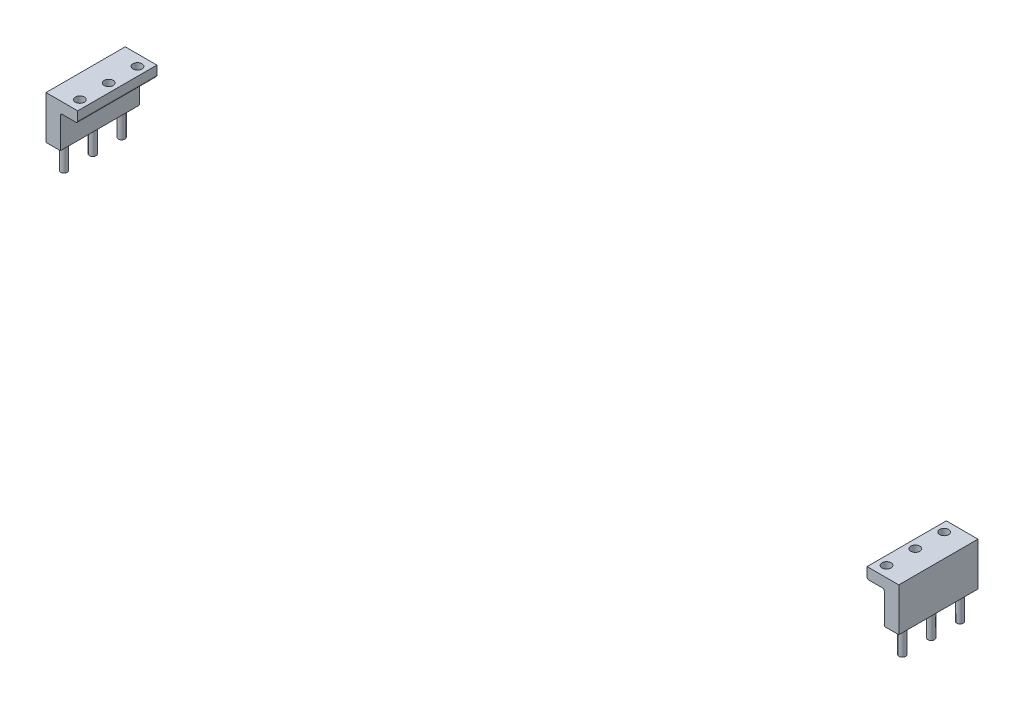
ISO-10303-21;
HEADER;
FILE_DESCRIPTION(('STEP AP214'),'2;1');
FILE_NAME('part.step','',(''),(''),'','','');
FILE_SCHEMA(('AUTOMOTIVE_DESIGN { 1 0 10303 214 1 1 1 1 }'));
ENDSEC;
DATA;
#1=APPLICATION_CONTEXT('core data for automotive mechanical design processes');
#2=APPLICATION_PROTOCOL_DEFINITION('international standard','automotive_design',2000,#1);
#3=PRODUCT_CONTEXT('',#1,'mechanical');
#4=PRODUCT('Part','Part','',(#3));
#5=PRODUCT_RELATED_PRODUCT_CATEGORY('part','',(#4));
#6=PRODUCT_DEFINITION_FORMATION('','',#4);
#7=PRODUCT_DEFINITION_CONTEXT('part definition',#1,'design');
#8=PRODUCT_DEFINITION('design','',#6,#7);
#9=PRODUCT_DEFINITION_SHAPE('','',#8);
#10=(LENGTH_UNIT() NAMED_UNIT(*) SI_UNIT(.MILLI.,.METRE.));
#11=(NAMED_UNIT(*) PLANE_ANGLE_UNIT() SI_UNIT($,.RADIAN.));
#12=(NAMED_UNIT(*) SI_UNIT($,.STERADIAN.) SOLID_ANGLE_UNIT());
#13=UNCERTAINTY_MEASURE_WITH_UNIT(LENGTH_MEASURE(1.E-05),#10,'distance_accuracy_value','');
#14=(GEOMETRIC_REPRESENTATION_CONTEXT(3) GLOBAL_UNCERTAINTY_ASSIGNED_CONTEXT((#13)) GLOBAL_UNIT_ASSIGNED_CONTEXT((#10,
#11,#12)) REPRESENTATION_CONTEXT('',''));
#15=CARTESIAN_POINT('',(0.,0.,0.));
#16=DIRECTION('',(0.,0.,1.));
#17=DIRECTION('',(1.,0.,0.));
#18=AXIS2_PLACEMENT_3D('',#15,#16,#17);
#19=CARTESIAN_POINT('',(374.55475,-81.3562,76.2));
#20=DIRECTION('',(0.,1.,0.));
#21=DIRECTION('',(0.,0.,1.));
#22=AXIS2_PLACEMENT_3D('',#19,#20,#21);
#23=PLANE('',#22);
#24=CARTESIAN_POINT('',(375.285,-81.3562,76.2));
#25=DIRECTION('',(0.,1.,0.));
#26=DIRECTION('',(0.,0.,-1.));
#27=AXIS2_PLACEMENT_3D('',#24,#25,#26);
#28=CIRCLE('',#27,1.4605);
#29=CARTESIAN_POINT('',(375.285,-81.3562,74.7395));
#30=VERTEX_POINT('',#29);
#31=EDGE_CURVE('P0_E11',#30,#30,#28,.T.);
#32=ORIENTED_EDGE('',*,*,#31,.F.);
#33=EDGE_LOOP('',(#32));
#34=FACE_BOUND('',#33,.T.);
#35=ADVANCED_FACE('P0_F17',(#34),#23,.F.);
#36=CARTESIAN_POINT('',(375.285,-75.6031,76.2));
#37=DIRECTION('',(0.,-1.,0.));
#38=DIRECTION('',(0.,0.,-1.));
#39=AXIS2_PLACEMENT_3D('',#36,#37,#38);
#40=CYLINDRICAL_SURFACE('',#39,1.4605);
#41=ORIENTED_EDGE('',*,*,#31,.T.);
#42=EDGE_LOOP('',(#41));
#43=FACE_BOUND('',#42,.T.);
#44=CARTESIAN_POINT('',(375.285,-71.12,76.2));
#45=DIRECTION('',(0.,1.,0.));
#46=DIRECTION('',(0.,0.,-1.));
#47=AXIS2_PLACEMENT_3D('',#44,#45,#46);
#48=CIRCLE('',#47,1.4605);
#49=CARTESIAN_POINT('',(375.285,-71.12,74.7395));
#50=VERTEX_POINT('',#49);
#51=EDGE_CURVE('P0_E164',#50,#50,#48,.T.);
#52=ORIENTED_EDGE('',*,*,#51,.F.);
#53=EDGE_LOOP('',(#52));
#54=FACE_BOUND('',#53,.T.);
#55=ADVANCED_FACE('P0_F175',(#43,#54),#40,.T.);
#56=CARTESIAN_POINT('',(375.285,-69.85,76.2));
#57=DIRECTION('',(0.,1.,0.));
#58=DIRECTION('',(0.,0.,1.));
#59=AXIS2_PLACEMENT_3D('',#56,#57,#58);
#60=CONICAL_SURFACE('',#59,2.7686,0.800175412804942);
#61=ORIENTED_EDGE('',*,*,#51,.T.);
#62=EDGE_LOOP('',(#61));
#63=FACE_BOUND('',#62,.T.);
#64=CARTESIAN_POINT('',(375.285,-69.85,76.2));
#65=DIRECTION('',(0.,1.,0.));
#66=DIRECTION('',(0.,0.,-1.));
#67=AXIS2_PLACEMENT_3D('',#64,#65,#66);
#68=CIRCLE('',#67,2.7686);
#69=CARTESIAN_POINT('',(375.285,-69.85,73.4314));
#70=VERTEX_POINT('',#69);
#71=EDGE_CURVE('P0_E24',#70,#70,#68,.T.);
#72=ORIENTED_EDGE('',*,*,#71,.F.);
#73=EDGE_LOOP('',(#72));
#74=FACE_BOUND('',#73,.T.);
#75=ADVANCED_FACE('P0_F172',(#63,#74),#60,.T.);
#76=CARTESIAN_POINT('',(374.55475,-81.3562,88.9));
#77=DIRECTION('',(0.,1.,0.));
#78=DIRECTION('',(0.,0.,1.));
#79=AXIS2_PLACEMENT_3D('',#76,#77,#78);
#80=PLANE('',#79);
#81=CARTESIAN_POINT('',(375.285,-81.3562,88.9));
#82=DIRECTION('',(0.,1.,0.));
#83=DIRECTION('',(0.,0.,-1.));
#84=AXIS2_PLACEMENT_3D('',#81,#82,#83);
#85=CIRCLE('',#84,1.4605);
#86=CARTESIAN_POINT('',(375.285,-81.3562,87.4395));
#87=VERTEX_POINT('',#86);
#88=EDGE_CURVE('P0_E161',#87,#87,#85,.T.);
#89=ORIENTED_EDGE('',*,*,#88,.F.);
#90=EDGE_LOOP('',(#89));
#91=FACE_BOUND('',#90,.T.);
#92=ADVANCED_FACE('P0_F174',(#91),#80,.F.);
#93=CARTESIAN_POINT('',(375.285,-75.6031,88.9));
#94=DIRECTION('',(0.,-1.,0.));
#95=DIRECTION('',(0.,0.,-1.));
#96=AXIS2_PLACEMENT_3D('',#93,#94,#95);
#97=CYLINDRICAL_SURFACE('',#96,1.4605);
#98=ORIENTED_EDGE('',*,*,#88,.T.);
#99=EDGE_LOOP('',(#98));
#100=FACE_BOUND('',#99,.T.);
#101=CARTESIAN_POINT('',(375.285,-71.12,88.9));
#102=DIRECTION('',(0.,1.,0.));
#103=DIRECTION('',(0.,0.,-1.));
#104=AXIS2_PLACEMENT_3D('',#101,#102,#103);
#105=CIRCLE('',#104,1.4605);
#106=CARTESIAN_POINT('',(375.285,-71.12,87.4395));
#107=VERTEX_POINT('',#106);
#108=EDGE_CURVE('P0_E155',#107,#107,#105,.T.);
#109=ORIENTED_EDGE('',*,*,#108,.F.);
#110=EDGE_LOOP('',(#109));
#111=FACE_BOUND('',#110,.T.);
#112=ADVANCED_FACE('P0_F183',(#100,#111),#97,.T.);
#113=CARTESIAN_POINT('',(375.285,-69.85,88.9));
#114=DIRECTION('',(0.,1.,0.));
#115=DIRECTION('',(0.,0.,1.));
#116=AXIS2_PLACEMENT_3D('',#113,#114,#115);
#117=CONICAL_SURFACE('',#116,2.7686,0.800175412804942);
#118=ORIENTED_EDGE('',*,*,#108,.T.);
#119=EDGE_LOOP('',(#118));
#120=FACE_BOUND('',#119,.T.);
#121=CARTESIAN_POINT('',(375.285,-69.85,88.9));
#122=DIRECTION('',(0.,1.,0.));
#123=DIRECTION('',(0.,0.,-1.));
#124=AXIS2_PLACEMENT_3D('',#121,#122,#123);
#125=CIRCLE('',#124,2.7686);
#126=CARTESIAN_POINT('',(375.285,-69.85,86.1314));
#127=VERTEX_POINT('',#126);
#128=EDGE_CURVE('P0_E158',#127,#127,#125,.T.);
#129=ORIENTED_EDGE('',*,*,#128,.F.);
#130=EDGE_LOOP('',(#129));
#131=FACE_BOUND('',#130,.T.);
#132=ADVANCED_FACE('P0_F216',(#120,#131),#117,.T.);
#133=CARTESIAN_POINT('',(364.49,-53.18125,106.3625));
#134=DIRECTION('',(1.,0.,0.));
#135=DIRECTION('',(0.,0.,1.));
#136=AXIS2_PLACEMENT_3D('',#133,#134,#135);
#137=PLANE('',#136);
#138=DIRECTION('',(0.,1.,0.));
#139=VECTOR('',#138,1.);
#140=CARTESIAN_POINT('',(364.49,-53.18125,106.3625));
#141=LINE('',#140,#139);
#142=CARTESIAN_POINT('',(364.49,-54.7243,106.3625));
#143=VERTEX_POINT('',#142);
#144=CARTESIAN_POINT('',(364.49,-50.8,106.3625));
#145=VERTEX_POINT('',#144);
#146=EDGE_CURVE('P0_E82',#143,#145,#141,.T.);
#147=ORIENTED_EDGE('',*,*,#146,.T.);
#148=DIRECTION('',(0.,0.,-1.));
#149=VECTOR('',#148,1.);
#150=CARTESIAN_POINT('',(364.49,-50.8,106.3625));
#151=LINE('',#150,#149);
#152=CARTESIAN_POINT('',(364.49,-50.8,71.4375));
#153=VERTEX_POINT('',#152);
#154=EDGE_CURVE('P0_E90',#145,#153,#151,.T.);
#155=ORIENTED_EDGE('',*,*,#154,.T.);
#156=DIRECTION('',(0.,1.,0.));
#157=VECTOR('',#156,1.);
#158=CARTESIAN_POINT('',(364.49,-53.18125,71.4375));
#159=LINE('',#158,#157);
#160=CARTESIAN_POINT('',(364.49,-54.7243,71.4375));
#161=VERTEX_POINT('',#160);
#162=EDGE_CURVE('P0_E123',#161,#153,#159,.T.);
#163=ORIENTED_EDGE('',*,*,#162,.F.);
#164=DIRECTION('',(0.,0.,-1.));
#165=VECTOR('',#164,1.);
#166=CARTESIAN_POINT('',(364.49,-54.7243,106.3625));
#167=LINE('',#166,#165);
#168=EDGE_CURVE('P0_E97',#143,#161,#167,.T.);
#169=ORIENTED_EDGE('',*,*,#168,.F.);
#170=EDGE_LOOP('',(#147,#155,#163,#169));
#171=FACE_BOUND('',#170,.T.);
#172=ADVANCED_FACE('P0_F101',(#171),#137,.F.);
#173=CARTESIAN_POINT('',(371.475,-50.8,106.3625));
#174=DIRECTION('',(0.,-1.,0.));
#175=DIRECTION('',(0.,0.,-1.));
#176=AXIS2_PLACEMENT_3D('',#173,#174,#175);
#177=PLANE('',#176);
#178=CARTESIAN_POINT('',(368.3,-50.8,101.6));
#179=DIRECTION('',(0.,1.,0.));
#180=DIRECTION('',(0.,0.,-1.));
#181=AXIS2_PLACEMENT_3D('',#178,#179,#180);
#182=CIRCLE('',#181,1.9939);
#183=CARTESIAN_POINT('',(368.3,-50.8,99.6061));
#184=VERTEX_POINT('',#183);
#185=EDGE_CURVE('P0_E109',#184,#184,#182,.T.);
#186=ORIENTED_EDGE('',*,*,#185,.F.);
#187=EDGE_LOOP('',(#186));
#188=FACE_BOUND('',#187,.T.);
#189=CARTESIAN_POINT('',(368.3,-50.8,88.9));
#190=DIRECTION('',(0.,1.,0.));
#191=DIRECTION('',(0.,0.,-1.));
#192=AXIS2_PLACEMENT_3D('',#189,#190,#191);
#193=CIRCLE('',#192,1.9939);
#194=CARTESIAN_POINT('',(368.3,-50.8,86.9061));
#195=VERTEX_POINT('',#194);
#196=EDGE_CURVE('P0_E371',#195,#195,#193,.T.);
#197=ORIENTED_EDGE('',*,*,#196,.F.);
#198=EDGE_LOOP('',(#197));
#199=FACE_BOUND('',#198,.T.);
#200=CARTESIAN_POINT('',(368.3,-50.8,76.2));
#201=DIRECTION('',(0.,1.,0.));
#202=DIRECTION('',(0.,0.,-1.));
#203=AXIS2_PLACEMENT_3D('',#200,#201,#202);
#204=CIRCLE('',#203,1.9939);
#205=CARTESIAN_POINT('',(368.3,-50.8,74.2061));
#206=VERTEX_POINT('',#205);
#207=EDGE_CURVE('P0_E364',#206,#206,#204,.T.);
#208=ORIENTED_EDGE('',*,*,#207,.F.);
#209=EDGE_LOOP('',(#208));
#210=FACE_BOUND('',#209,.T.);
#211=DIRECTION('',(1.,0.,0.));
#212=VECTOR('',#211,1.);
#213=CARTESIAN_POINT('',(371.475,-50.8,71.4375));
#214=LINE('',#213,#212);
#215=CARTESIAN_POINT('',(378.46,-50.8,71.4375));
#216=VERTEX_POINT('',#215);
#217=EDGE_CURVE('P0_E93',#153,#216,#214,.T.);
#218=ORIENTED_EDGE('',*,*,#217,.F.);
#219=ORIENTED_EDGE('',*,*,#154,.F.);
#220=DIRECTION('',(1.,0.,0.));
#221=VECTOR('',#220,1.);
#222=CARTESIAN_POINT('',(371.475,-50.8,106.3625));
#223=LINE('',#222,#221);
#224=CARTESIAN_POINT('',(378.46,-50.8,106.3625));
#225=VERTEX_POINT('',#224);
#226=EDGE_CURVE('P0_E78',#145,#225,#223,.T.);
#227=ORIENTED_EDGE('',*,*,#226,.T.);
#228=DIRECTION('',(0.,0.,-1.));
#229=VECTOR('',#228,1.);
#230=CARTESIAN_POINT('',(378.46,-50.8,106.3625));
#231=LINE('',#230,#229);
#232=EDGE_CURVE('P0_E98',#225,#216,#231,.T.);
#233=ORIENTED_EDGE('',*,*,#232,.T.);
#234=EDGE_LOOP('',(#218,#219,#227,#233));
#235=FACE_BOUND('',#234,.T.);
#236=ADVANCED_FACE('P0_F91',(#188,#199,#210,#235),#177,.F.);
#237=CARTESIAN_POINT('',(378.46,-60.325,106.3625));
#238=DIRECTION('',(-1.,0.,0.));
#239=DIRECTION('',(0.,0.,-1.));
#240=AXIS2_PLACEMENT_3D('',#237,#238,#239);
#241=PLANE('',#240);
#242=DIRECTION('',(0.,-1.,0.));
#243=VECTOR('',#242,1.);
#244=CARTESIAN_POINT('',(378.46,-60.325,71.4375));
#245=LINE('',#244,#243);
#246=CARTESIAN_POINT('',(378.46,-69.85,71.4375));
#247=VERTEX_POINT('',#246);
#248=EDGE_CURVE('P0_E126',#216,#247,#245,.T.);
#249=ORIENTED_EDGE('',*,*,#248,.F.);
#250=ORIENTED_EDGE('',*,*,#232,.F.);
#251=DIRECTION('',(0.,-1.,0.));
#252=VECTOR('',#251,1.);
#253=CARTESIAN_POINT('',(378.46,-60.325,106.3625));
#254=LINE('',#253,#252);
#255=CARTESIAN_POINT('',(378.46,-69.85,106.3625));
#256=VERTEX_POINT('',#255);
#257=EDGE_CURVE('P0_E84',#225,#256,#254,.T.);
#258=ORIENTED_EDGE('',*,*,#257,.T.);
#259=DIRECTION('',(0.,0.,-1.));
#260=VECTOR('',#259,1.);
#261=CARTESIAN_POINT('',(378.46,-69.85,106.3625));
#262=LINE('',#261,#260);
#263=EDGE_CURVE('P0_E136',#256,#247,#262,.T.);
#264=ORIENTED_EDGE('',*,*,#263,.T.);
#265=EDGE_LOOP('',(#249,#250,#258,#264));
#266=FACE_BOUND('',#265,.T.);
#267=ADVANCED_FACE('P0_F237',(#266),#241,.F.);
#268=CARTESIAN_POINT('',(375.285,-69.85,106.3625));
#269=DIRECTION('',(0.,1.,0.));
#270=DIRECTION('',(0.,0.,1.));
#271=AXIS2_PLACEMENT_3D('',#268,#269,#270);
#272=PLANE('',#271);
#273=ORIENTED_EDGE('',*,*,#71,.T.);
#274=EDGE_LOOP('',(#273));
#275=FACE_BOUND('',#274,.T.);
#276=ORIENTED_EDGE('',*,*,#128,.T.);
#277=EDGE_LOOP('',(#276));
#278=FACE_BOUND('',#277,.T.);
#279=CARTESIAN_POINT('',(375.285,-69.85,101.6));
#280=DIRECTION('',(0.,1.,0.));
#281=DIRECTION('',(0.,0.,-1.));
#282=AXIS2_PLACEMENT_3D('',#279,#280,#281);
#283=CIRCLE('',#282,2.7686);
#284=CARTESIAN_POINT('',(375.285,-69.85,98.8314));
#285=VERTEX_POINT('',#284);
#286=EDGE_CURVE('P0_E154',#285,#285,#283,.T.);
#287=ORIENTED_EDGE('',*,*,#286,.T.);
#288=EDGE_LOOP('',(#287));
#289=FACE_BOUND('',#288,.T.);
#290=DIRECTION('',(-1.,0.,0.));
#291=VECTOR('',#290,1.);
#292=CARTESIAN_POINT('',(375.285,-69.85,71.4375));
#293=LINE('',#292,#291);
#294=CARTESIAN_POINT('',(372.11,-69.85,71.4375));
#295=VERTEX_POINT('',#294);
#296=EDGE_CURVE('P0_E129',#247,#295,#293,.T.);
#297=ORIENTED_EDGE('',*,*,#296,.F.);
#298=ORIENTED_EDGE('',*,*,#263,.F.);
#299=DIRECTION('',(-1.,0.,0.));
#300=VECTOR('',#299,1.);
#301=CARTESIAN_POINT('',(375.285,-69.85,106.3625));
#302=LINE('',#301,#300);
#303=CARTESIAN_POINT('',(372.11,-69.85,106.3625));
#304=VERTEX_POINT('',#303);
#305=EDGE_CURVE('P0_E113',#256,#304,#302,.T.);
#306=ORIENTED_EDGE('',*,*,#305,.T.);
#307=DIRECTION('',(0.,0.,-1.));
#308=VECTOR('',#307,1.);
#309=CARTESIAN_POINT('',(372.11,-69.85,106.3625));
#310=LINE('',#309,#308);
#311=EDGE_CURVE('P0_E122',#304,#295,#310,.T.);
#312=ORIENTED_EDGE('',*,*,#311,.T.);
#313=EDGE_LOOP('',(#297,#298,#306,#312));
#314=FACE_BOUND('',#313,.T.);
#315=ADVANCED_FACE('P0_F169',(#275,#278,#289,#314),#272,.F.);
#316=CARTESIAN_POINT('',(372.11,-62.70625,106.3625));
#317=DIRECTION('',(1.,0.,0.));
#318=DIRECTION('',(0.,0.,1.));
#319=AXIS2_PLACEMENT_3D('',#316,#317,#318);
#320=PLANE('',#319);
#321=DIRECTION('',(0.,1.,0.));
#322=VECTOR('',#321,1.);
#323=CARTESIAN_POINT('',(372.11,-62.70625,71.4375));
#324=LINE('',#323,#322);
#325=CARTESIAN_POINT('',(372.11,-56.4007,71.4375));
#326=VERTEX_POINT('',#325);
#327=EDGE_CURVE('P0_E106',#295,#326,#324,.T.);
#328=ORIENTED_EDGE('',*,*,#327,.F.);
#329=ORIENTED_EDGE('',*,*,#311,.F.);
#330=DIRECTION('',(0.,1.,0.));
#331=VECTOR('',#330,1.);
#332=CARTESIAN_POINT('',(372.11,-62.70625,106.3625));
#333=LINE('',#332,#331);
#334=CARTESIAN_POINT('',(372.11,-56.4007,106.3625));
#335=VERTEX_POINT('',#334);
#336=EDGE_CURVE('P0_E116',#304,#335,#333,.T.);
#337=ORIENTED_EDGE('',*,*,#336,.T.);
#338=DIRECTION('',(0.,0.,-1.));
#339=VECTOR('',#338,1.);
#340=CARTESIAN_POINT('',(372.11,-56.4007,106.3625));
#341=LINE('',#340,#339);
#342=EDGE_CURVE('P0_E149',#326,#335,#341,.F.);
#343=ORIENTED_EDGE('',*,*,#342,.F.);
#344=EDGE_LOOP('',(#328,#329,#337,#343));
#345=FACE_BOUND('',#344,.T.);
#346=ADVANCED_FACE('P0_F252',(#345),#320,.F.);
#347=CARTESIAN_POINT('',(368.3,-55.5625,106.3625));
#348=DIRECTION('',(0.,1.,0.));
#349=DIRECTION('',(0.,0.,1.));
#350=AXIS2_PLACEMENT_3D('',#347,#348,#349);
#351=PLANE('',#350);
#352=CARTESIAN_POINT('',(368.3,-55.5625,101.6));
#353=DIRECTION('',(0.,1.,0.));
#354=DIRECTION('',(0.,0.,-1.));
#355=AXIS2_PLACEMENT_3D('',#352,#353,#354);
#356=CIRCLE('',#355,1.9939);
#357=CARTESIAN_POINT('',(368.3,-55.5625,99.6061));
#358=VERTEX_POINT('',#357);
#359=EDGE_CURVE('P0_E361',#358,#358,#356,.T.);
#360=ORIENTED_EDGE('',*,*,#359,.T.);
#361=EDGE_LOOP('',(#360));
#362=FACE_BOUND('',#361,.T.);
#363=CARTESIAN_POINT('',(368.3,-55.5625,88.9));
#364=DIRECTION('',(0.,1.,0.));
#365=DIRECTION('',(0.,0.,-1.));
#366=AXIS2_PLACEMENT_3D('',#363,#364,#365);
#367=CIRCLE('',#366,1.9939);
#368=CARTESIAN_POINT('',(368.3,-55.5625,86.9061));
#369=VERTEX_POINT('',#368);
#370=EDGE_CURVE('P0_E365',#369,#369,#367,.T.);
#371=ORIENTED_EDGE('',*,*,#370,.T.);
#372=EDGE_LOOP('',(#371));
#373=FACE_BOUND('',#372,.T.);
#374=CARTESIAN_POINT('',(368.3,-55.5625,76.2));
#375=DIRECTION('',(0.,1.,0.));
#376=DIRECTION('',(0.,0.,-1.));
#377=AXIS2_PLACEMENT_3D('',#374,#375,#376);
#378=CIRCLE('',#377,1.9939);
#379=CARTESIAN_POINT('',(368.3,-55.5625,74.2061));
#380=VERTEX_POINT('',#379);
#381=EDGE_CURVE('P0_E360',#380,#380,#378,.T.);
#382=ORIENTED_EDGE('',*,*,#381,.T.);
#383=EDGE_LOOP('',(#382));
#384=FACE_BOUND('',#383,.T.);
#385=DIRECTION('',(-1.,0.,0.));
#386=VECTOR('',#385,1.);
#387=CARTESIAN_POINT('',(368.3,-55.5625,71.4375));
#388=LINE('',#387,#386);
#389=CARTESIAN_POINT('',(371.2718,-55.5625,71.4375));
#390=VERTEX_POINT('',#389);
#391=CARTESIAN_POINT('',(365.3282,-55.5625,71.4375));
#392=VERTEX_POINT('',#391);
#393=EDGE_CURVE('P0_E103',#390,#392,#388,.T.);
#394=ORIENTED_EDGE('',*,*,#393,.F.);
#395=DIRECTION('',(0.,0.,-1.));
#396=VECTOR('',#395,1.);
#397=CARTESIAN_POINT('',(371.2718,-55.5625,71.4375));
#398=LINE('',#397,#396);
#399=CARTESIAN_POINT('',(371.2718,-55.5625,106.3625));
#400=VERTEX_POINT('',#399);
#401=EDGE_CURVE('P0_E143',#400,#390,#398,.T.);
#402=ORIENTED_EDGE('',*,*,#401,.F.);
#403=DIRECTION('',(-1.,0.,0.));
#404=VECTOR('',#403,1.);
#405=CARTESIAN_POINT('',(368.3,-55.5625,106.3625));
#406=LINE('',#405,#404);
#407=CARTESIAN_POINT('',(365.3282,-55.5625,106.3625));
#408=VERTEX_POINT('',#407);
#409=EDGE_CURVE('P0_E119',#400,#408,#406,.T.);
#410=ORIENTED_EDGE('',*,*,#409,.T.);
#411=DIRECTION('',(0.,0.,-1.));
#412=VECTOR('',#411,1.);
#413=CARTESIAN_POINT('',(365.3282,-55.5625,106.3625));
#414=LINE('',#413,#412);
#415=EDGE_CURVE('P0_E146',#392,#408,#414,.F.);
#416=ORIENTED_EDGE('',*,*,#415,.F.);
#417=EDGE_LOOP('',(#394,#402,#410,#416));
#418=FACE_BOUND('',#417,.T.);
#419=ADVANCED_FACE('P0_F259',(#362,#373,#384,#418),#351,.F.);
#420=CARTESIAN_POINT('',(371.475,-60.325,106.3625));
#421=DIRECTION('',(0.,0.,1.));
#422=DIRECTION('',(-1.,0.,0.));
#423=AXIS2_PLACEMENT_3D('',#420,#421,#422);
#424=PLANE('',#423);
#425=ORIENTED_EDGE('',*,*,#409,.F.);
#426=CARTESIAN_POINT('',(371.2718,-56.4007,106.3625));
#427=DIRECTION('',(0.,0.,-1.));
#428=DIRECTION('',(-1.,0.,0.));
#429=AXIS2_PLACEMENT_3D('',#426,#427,#428);
#430=CIRCLE('',#429,0.8382);
#431=EDGE_CURVE('P0_E31',#335,#400,#430,.F.);
#432=ORIENTED_EDGE('',*,*,#431,.F.);
#433=ORIENTED_EDGE('',*,*,#336,.F.);
#434=ORIENTED_EDGE('',*,*,#305,.F.);
#435=ORIENTED_EDGE('',*,*,#257,.F.);
#436=ORIENTED_EDGE('',*,*,#226,.F.);
#437=ORIENTED_EDGE('',*,*,#146,.F.);
#438=CARTESIAN_POINT('',(365.3282,-54.7243,106.3625));
#439=DIRECTION('',(0.,0.,-1.));
#440=DIRECTION('',(-1.,0.,0.));
#441=AXIS2_PLACEMENT_3D('',#438,#439,#440);
#442=CIRCLE('',#441,0.8382);
#443=EDGE_CURVE('P0_E37',#408,#143,#442,.T.);
#444=ORIENTED_EDGE('',*,*,#443,.F.);
#445=EDGE_LOOP('',(#425,#432,#433,#434,#435,#436,#437,#444));
#446=FACE_BOUND('',#445,.T.);
#447=ADVANCED_FACE('P0_F80',(#446),#424,.T.);
#448=CARTESIAN_POINT('',(371.475,-60.325,71.4375));
#449=DIRECTION('',(0.,0.,1.));
#450=DIRECTION('',(-1.,0.,0.));
#451=AXIS2_PLACEMENT_3D('',#448,#449,#450);
#452=PLANE('',#451);
#453=ORIENTED_EDGE('',*,*,#162,.T.);
#454=ORIENTED_EDGE('',*,*,#217,.T.);
#455=ORIENTED_EDGE('',*,*,#248,.T.);
#456=ORIENTED_EDGE('',*,*,#296,.T.);
#457=ORIENTED_EDGE('',*,*,#327,.T.);
#458=CARTESIAN_POINT('',(371.2718,-56.4007,71.4375));
#459=DIRECTION('',(0.,0.,-1.));
#460=DIRECTION('',(-1.,0.,0.));
#461=AXIS2_PLACEMENT_3D('',#458,#459,#460);
#462=CIRCLE('',#461,0.8382);
#463=EDGE_CURVE('P0_E151',#390,#326,#462,.T.);
#464=ORIENTED_EDGE('',*,*,#463,.F.);
#465=ORIENTED_EDGE('',*,*,#393,.T.);
#466=CARTESIAN_POINT('',(365.3282,-54.7243,71.4375));
#467=DIRECTION('',(0.,0.,-1.));
#468=DIRECTION('',(-1.,0.,0.));
#469=AXIS2_PLACEMENT_3D('',#466,#467,#468);
#470=CIRCLE('',#469,0.8382);
#471=EDGE_CURVE('P0_E141',#161,#392,#470,.F.);
#472=ORIENTED_EDGE('',*,*,#471,.F.);
#473=EDGE_LOOP('',(#453,#454,#455,#456,#457,#464,#465,#472));
#474=FACE_BOUND('',#473,.T.);
#475=ADVANCED_FACE('P0_F274',(#474),#452,.F.);
#476=CARTESIAN_POINT('',(368.3,-30.1625,76.2));
#477=DIRECTION('',(0.,-1.,0.));
#478=DIRECTION('',(0.,0.,-1.));
#479=AXIS2_PLACEMENT_3D('',#476,#477,#478);
#480=CYLINDRICAL_SURFACE('',#479,1.9939);
#481=ORIENTED_EDGE('',*,*,#381,.F.);
#482=EDGE_LOOP('',(#481));
#483=FACE_BOUND('',#482,.T.);
#484=ORIENTED_EDGE('',*,*,#207,.T.);
#485=EDGE_LOOP('',(#484));
#486=FACE_BOUND('',#485,.T.);
#487=ADVANCED_FACE('P0_F281',(#483,#486),#480,.F.);
#488=CARTESIAN_POINT('',(368.3,-30.1625,88.9));
#489=DIRECTION('',(0.,-1.,0.));
#490=DIRECTION('',(0.,0.,-1.));
#491=AXIS2_PLACEMENT_3D('',#488,#489,#490);
#492=CYLINDRICAL_SURFACE('',#491,1.9939);
#493=ORIENTED_EDGE('',*,*,#370,.F.);
#494=EDGE_LOOP('',(#493));
#495=FACE_BOUND('',#494,.T.);
#496=ORIENTED_EDGE('',*,*,#196,.T.);
#497=EDGE_LOOP('',(#496));
#498=FACE_BOUND('',#497,.T.);
#499=ADVANCED_FACE('P0_F289',(#495,#498),#492,.F.);
#500=CARTESIAN_POINT('',(368.3,-30.1625,101.6));
#501=DIRECTION('',(0.,-1.,0.));
#502=DIRECTION('',(0.,0.,-1.));
#503=AXIS2_PLACEMENT_3D('',#500,#501,#502);
#504=CYLINDRICAL_SURFACE('',#503,1.9939);
#505=ORIENTED_EDGE('',*,*,#359,.F.);
#506=EDGE_LOOP('',(#505));
#507=FACE_BOUND('',#506,.T.);
#508=ORIENTED_EDGE('',*,*,#185,.T.);
#509=EDGE_LOOP('',(#508));
#510=FACE_BOUND('',#509,.T.);
#511=ADVANCED_FACE('P0_F297',(#507,#510),#504,.F.);
#512=CARTESIAN_POINT('',(365.3282,-54.7243,106.3625));
#513=DIRECTION('',(0.,0.,-1.));
#514=DIRECTION('',(1.,0.,0.));
#515=AXIS2_PLACEMENT_3D('',#512,#513,#514);
#516=CYLINDRICAL_SURFACE('',#515,0.8382);
#517=ORIENTED_EDGE('',*,*,#443,.T.);
#518=ORIENTED_EDGE('',*,*,#168,.T.);
#519=ORIENTED_EDGE('',*,*,#471,.T.);
#520=ORIENTED_EDGE('',*,*,#415,.T.);
#521=EDGE_LOOP('',(#517,#518,#519,#520));
#522=FACE_BOUND('',#521,.T.);
#523=ADVANCED_FACE('P0_F305',(#522),#516,.T.);
#524=CARTESIAN_POINT('',(371.2718,-56.4007,106.3625));
#525=DIRECTION('',(0.,0.,1.));
#526=DIRECTION('',(-1.,0.,0.));
#527=AXIS2_PLACEMENT_3D('',#524,#525,#526);
#528=CYLINDRICAL_SURFACE('',#527,0.8382);
#529=ORIENTED_EDGE('',*,*,#431,.T.);
#530=ORIENTED_EDGE('',*,*,#401,.T.);
#531=ORIENTED_EDGE('',*,*,#463,.T.);
#532=ORIENTED_EDGE('',*,*,#342,.T.);
#533=EDGE_LOOP('',(#529,#530,#531,#532));
#534=FACE_BOUND('',#533,.T.);
#535=ADVANCED_FACE('P0_F313',(#534),#528,.F.);
#536=CARTESIAN_POINT('',(374.55475,-81.3562,101.6));
#537=DIRECTION('',(0.,1.,0.));
#538=DIRECTION('',(0.,0.,1.));
#539=AXIS2_PLACEMENT_3D('',#536,#537,#538);
#540=PLANE('',#539);
#541=CARTESIAN_POINT('',(375.285,-81.3562,101.6));
#542=DIRECTION('',(0.,1.,0.));
#543=DIRECTION('',(0.,0.,-1.));
#544=AXIS2_PLACEMENT_3D('',#541,#542,#543);
#545=CIRCLE('',#544,1.4605);
#546=CARTESIAN_POINT('',(375.285,-81.3562,100.1395));
#547=VERTEX_POINT('',#546);
#548=EDGE_CURVE('P0_E357',#547,#547,#545,.T.);
#549=ORIENTED_EDGE('',*,*,#548,.F.);
#550=EDGE_LOOP('',(#549));
#551=FACE_BOUND('',#550,.T.);
#552=ADVANCED_FACE('P0_F321',(#551),#540,.F.);
#553=CARTESIAN_POINT('',(375.285,-75.6031,101.6));
#554=DIRECTION('',(0.,-1.,0.));
#555=DIRECTION('',(0.,0.,-1.));
#556=AXIS2_PLACEMENT_3D('',#553,#554,#555);
#557=CYLINDRICAL_SURFACE('',#556,1.4605);
#558=ORIENTED_EDGE('',*,*,#548,.T.);
#559=EDGE_LOOP('',(#558));
#560=FACE_BOUND('',#559,.T.);
#561=CARTESIAN_POINT('',(375.285,-71.12,101.6));
#562=DIRECTION('',(0.,1.,0.));
#563=DIRECTION('',(0.,0.,-1.));
#564=AXIS2_PLACEMENT_3D('',#561,#562,#563);
#565=CIRCLE('',#564,1.4605);
#566=CARTESIAN_POINT('',(375.285,-71.12,100.1395));
#567=VERTEX_POINT('',#566);
#568=EDGE_CURVE('P0_E350',#567,#567,#565,.T.);
#569=ORIENTED_EDGE('',*,*,#568,.F.);
#570=EDGE_LOOP('',(#569));
#571=FACE_BOUND('',#570,.T.);
#572=ADVANCED_FACE('P0_F329',(#560,#571),#557,.T.);
#573=CARTESIAN_POINT('',(375.285,-69.85,101.6));
#574=DIRECTION('',(0.,1.,0.));
#575=DIRECTION('',(0.,0.,1.));
#576=AXIS2_PLACEMENT_3D('',#573,#574,#575);
#577=CONICAL_SURFACE('',#576,2.7686,0.800175412804942);
#578=ORIENTED_EDGE('',*,*,#568,.T.);
#579=EDGE_LOOP('',(#578));
#580=FACE_BOUND('',#579,.T.);
#581=ORIENTED_EDGE('',*,*,#286,.F.);
#582=EDGE_LOOP('',(#581));
#583=FACE_BOUND('',#582,.T.);
#584=ADVANCED_FACE('P0_F337',(#580,#583),#577,.T.);
#585=CLOSED_SHELL('',(#35,#55,#75,#92,#112,#132,#172,#236,#267,#315,#346,#419,#447,#475,#487,
#499,#511,#523,#535,#552,#572,#584));
#586=MANIFOLD_SOLID_BREP('P0_B1',#585);
#587=CARTESIAN_POINT('',(6.44524999999973,-81.3562,76.2));
#588=DIRECTION('',(0.,1.,0.));
#589=DIRECTION('',(0.,0.,1.));
#590=AXIS2_PLACEMENT_3D('',#587,#588,#589);
#591=PLANE('',#590);
#592=CARTESIAN_POINT('',(5.71499999999973,-81.3562,76.2));
#593=DIRECTION('',(0.,-1.,0.));
#594=DIRECTION('',(0.,0.,-1.));
#595=AXIS2_PLACEMENT_3D('',#592,#593,#594);
#596=CIRCLE('',#595,1.4605);
#597=CARTESIAN_POINT('',(5.71499999999973,-81.3562,74.7395));
#598=VERTEX_POINT('',#597);
#599=EDGE_CURVE('P1_E11',#598,#598,#596,.T.);
#600=ORIENTED_EDGE('',*,*,#599,.T.);
#601=EDGE_LOOP('',(#600));
#602=FACE_BOUND('',#601,.T.);
#603=ADVANCED_FACE('P1_F17',(#602),#591,.F.);
#604=CARTESIAN_POINT('',(5.71499999999973,-75.6031,76.2));
#605=DIRECTION('',(0.,-1.,0.));
#606=DIRECTION('',(0.,0.,-1.));
#607=AXIS2_PLACEMENT_3D('',#604,#605,#606);
#608=CYLINDRICAL_SURFACE('',#607,1.4605);
#609=ORIENTED_EDGE('',*,*,#599,.F.);
#610=EDGE_LOOP('',(#609));
#611=FACE_BOUND('',#610,.T.);
#612=CARTESIAN_POINT('',(5.71499999999973,-71.12,76.2));
#613=DIRECTION('',(0.,-1.,0.));
#614=DIRECTION('',(0.,0.,-1.));
#615=AXIS2_PLACEMENT_3D('',#612,#613,#614);
#616=CIRCLE('',#615,1.4605);
#617=CARTESIAN_POINT('',(5.71499999999973,-71.12,74.7395));
#618=VERTEX_POINT('',#617);
#619=EDGE_CURVE('P1_E139',#618,#618,#616,.T.);
#620=ORIENTED_EDGE('',*,*,#619,.T.);
#621=EDGE_LOOP('',(#620));
#622=FACE_BOUND('',#621,.T.);
#623=ADVANCED_FACE('P1_F227',(#611,#622),#608,.T.);
#624=CARTESIAN_POINT('',(5.71499999999973,-69.85,76.2));
#625=DIRECTION('',(0.,1.,0.));
#626=DIRECTION('',(0.,0.,1.));
#627=AXIS2_PLACEMENT_3D('',#624,#625,#626);
#628=CONICAL_SURFACE('',#627,2.7686,0.800175412804942);
#629=ORIENTED_EDGE('',*,*,#619,.F.);
#630=EDGE_LOOP('',(#629));
#631=FACE_BOUND('',#630,.T.);
#632=CARTESIAN_POINT('',(5.71499999999973,-69.85,76.2));
#633=DIRECTION('',(0.,-1.,0.));
#634=DIRECTION('',(0.,0.,-1.));
#635=AXIS2_PLACEMENT_3D('',#632,#633,#634);
#636=CIRCLE('',#635,2.7686);
#637=CARTESIAN_POINT('',(5.71499999999973,-69.85,73.4314));
#638=VERTEX_POINT('',#637);
#639=EDGE_CURVE('P1_E24',#638,#638,#636,.T.);
#640=ORIENTED_EDGE('',*,*,#639,.T.);
#641=EDGE_LOOP('',(#640));
#642=FACE_BOUND('',#641,.T.);
#643=ADVANCED_FACE('P1_F144',(#631,#642),#628,.T.);
#644=CARTESIAN_POINT('',(6.44524999999972,-81.3562,88.9));
#645=DIRECTION('',(0.,1.,0.));
#646=DIRECTION('',(0.,0.,1.));
#647=AXIS2_PLACEMENT_3D('',#644,#645,#646);
#648=PLANE('',#647);
#649=CARTESIAN_POINT('',(5.71499999999972,-81.3562,88.9));
#650=DIRECTION('',(0.,-1.,0.));
#651=DIRECTION('',(0.,0.,-1.));
#652=AXIS2_PLACEMENT_3D('',#649,#650,#651);
#653=CIRCLE('',#652,1.4605);
#654=CARTESIAN_POINT('',(5.71499999999972,-81.3562,87.4395));
#655=VERTEX_POINT('',#654);
#656=EDGE_CURVE('P1_E136',#655,#655,#653,.T.);
#657=ORIENTED_EDGE('',*,*,#656,.T.);
#658=EDGE_LOOP('',(#657));
#659=FACE_BOUND('',#658,.T.);
#660=ADVANCED_FACE('P1_F238',(#659),#648,.F.);
#661=CARTESIAN_POINT('',(5.71499999999972,-75.6031,88.9));
#662=DIRECTION('',(0.,-1.,0.));
#663=DIRECTION('',(0.,0.,-1.));
#664=AXIS2_PLACEMENT_3D('',#661,#662,#663);
#665=CYLINDRICAL_SURFACE('',#664,1.4605);
#666=ORIENTED_EDGE('',*,*,#656,.F.);
#667=EDGE_LOOP('',(#666));
#668=FACE_BOUND('',#667,.T.);
#669=CARTESIAN_POINT('',(5.71499999999972,-71.12,88.9));
#670=DIRECTION('',(0.,-1.,0.));
#671=DIRECTION('',(0.,0.,-1.));
#672=AXIS2_PLACEMENT_3D('',#669,#670,#671);
#673=CIRCLE('',#672,1.4605);
#674=CARTESIAN_POINT('',(5.71499999999972,-71.12,87.4395));
#675=VERTEX_POINT('',#674);
#676=EDGE_CURVE('P1_E130',#675,#675,#673,.T.);
#677=ORIENTED_EDGE('',*,*,#676,.T.);
#678=EDGE_LOOP('',(#677));
#679=FACE_BOUND('',#678,.T.);
#680=ADVANCED_FACE('P1_F243',(#668,#679),#665,.T.);
#681=CARTESIAN_POINT('',(5.71499999999972,-69.85,88.9));
#682=DIRECTION('',(0.,1.,0.));
#683=DIRECTION('',(0.,0.,1.));
#684=AXIS2_PLACEMENT_3D('',#681,#682,#683);
#685=CONICAL_SURFACE('',#684,2.7686,0.800175412804942);
#686=ORIENTED_EDGE('',*,*,#676,.F.);
#687=EDGE_LOOP('',(#686));
#688=FACE_BOUND('',#687,.T.);
#689=CARTESIAN_POINT('',(5.71499999999972,-69.85,88.9));
#690=DIRECTION('',(0.,-1.,0.));
#691=DIRECTION('',(0.,0.,-1.));
#692=AXIS2_PLACEMENT_3D('',#689,#690,#691);
#693=CIRCLE('',#692,2.7686);
#694=CARTESIAN_POINT('',(5.71499999999972,-69.85,86.1314));
#695=VERTEX_POINT('',#694);
#696=EDGE_CURVE('P1_E133',#695,#695,#693,.T.);
#697=ORIENTED_EDGE('',*,*,#696,.T.);
#698=EDGE_LOOP('',(#697));
#699=FACE_BOUND('',#698,.T.);
#700=ADVANCED_FACE('P1_F249',(#688,#699),#685,.T.);
#701=CARTESIAN_POINT('',(16.5099999999997,-53.18125,106.3625));
#702=DIRECTION('',(-1.,0.,0.));
#703=DIRECTION('',(0.,0.,1.));
#704=AXIS2_PLACEMENT_3D('',#701,#702,#703);
#705=PLANE('',#704);
#706=DIRECTION('',(0.,1.,0.));
#707=VECTOR('',#706,1.);
#708=CARTESIAN_POINT('',(16.5099999999997,-53.18125,106.3625));
#709=LINE('',#708,#707);
#710=CARTESIAN_POINT('',(16.5099999999997,-54.7243,106.3625));
#711=VERTEX_POINT('',#710);
#712=CARTESIAN_POINT('',(16.5099999999997,-50.8,106.3625));
#713=VERTEX_POINT('',#712);
#714=EDGE_CURVE('P1_E84',#711,#713,#709,.T.);
#715=ORIENTED_EDGE('',*,*,#714,.F.);
#716=DIRECTION('',(0.,0.,-1.));
#717=VECTOR('',#716,1.);
#718=CARTESIAN_POINT('',(16.5099999999997,-54.7243,106.3625));
#719=LINE('',#718,#717);
#720=CARTESIAN_POINT('',(16.5099999999997,-54.7243,71.4375));
#721=VERTEX_POINT('',#720);
#722=EDGE_CURVE('P1_E110',#711,#721,#719,.T.);
#723=ORIENTED_EDGE('',*,*,#722,.T.);
#724=DIRECTION('',(0.,1.,0.));
#725=VECTOR('',#724,1.);
#726=CARTESIAN_POINT('',(16.5099999999997,-53.18125,71.4375));
#727=LINE('',#726,#725);
#728=CARTESIAN_POINT('',(16.5099999999997,-50.8,71.4375));
#729=VERTEX_POINT('',#728);
#730=EDGE_CURVE('P1_E108',#721,#729,#727,.T.);
#731=ORIENTED_EDGE('',*,*,#730,.T.);
#732=DIRECTION('',(0.,0.,-1.));
#733=VECTOR('',#732,1.);
#734=CARTESIAN_POINT('',(16.5099999999997,-50.8,106.3625));
#735=LINE('',#734,#733);
#736=EDGE_CURVE('P1_E100',#713,#729,#735,.T.);
#737=ORIENTED_EDGE('',*,*,#736,.F.);
#738=EDGE_LOOP('',(#715,#723,#731,#737));
#739=FACE_BOUND('',#738,.T.);
#740=ADVANCED_FACE('P1_F106',(#739),#705,.F.);
#741=CARTESIAN_POINT('',(9.5249999999997,-50.8,106.3625));
#742=DIRECTION('',(0.,-1.,0.));
#743=DIRECTION('',(0.,0.,-1.));
#744=AXIS2_PLACEMENT_3D('',#741,#742,#743);
#745=PLANE('',#744);
#746=CARTESIAN_POINT('',(12.6999999999998,-50.8,101.6));
#747=DIRECTION('',(0.,-1.,0.));
#748=DIRECTION('',(0.,0.,-1.));
#749=AXIS2_PLACEMENT_3D('',#746,#747,#748);
#750=CIRCLE('',#749,1.9939);
#751=CARTESIAN_POINT('',(12.6999999999998,-50.8,99.6061));
#752=VERTEX_POINT('',#751);
#753=EDGE_CURVE('P1_E183',#752,#752,#750,.T.);
#754=ORIENTED_EDGE('',*,*,#753,.T.);
#755=EDGE_LOOP('',(#754));
#756=FACE_BOUND('',#755,.T.);
#757=CARTESIAN_POINT('',(12.6999999999998,-50.8,88.9));
#758=DIRECTION('',(0.,-1.,0.));
#759=DIRECTION('',(0.,0.,-1.));
#760=AXIS2_PLACEMENT_3D('',#757,#758,#759);
#761=CIRCLE('',#760,1.9939);
#762=CARTESIAN_POINT('',(12.6999999999998,-50.8,86.9061));
#763=VERTEX_POINT('',#762);
#764=EDGE_CURVE('P1_E191',#763,#763,#761,.T.);
#765=ORIENTED_EDGE('',*,*,#764,.T.);
#766=EDGE_LOOP('',(#765));
#767=FACE_BOUND('',#766,.T.);
#768=CARTESIAN_POINT('',(12.6999999999998,-50.8,76.2));
#769=DIRECTION('',(0.,-1.,0.));
#770=DIRECTION('',(0.,0.,-1.));
#771=AXIS2_PLACEMENT_3D('',#768,#769,#770);
#772=CIRCLE('',#771,1.9939);
#773=CARTESIAN_POINT('',(12.6999999999998,-50.8,74.2061));
#774=VERTEX_POINT('',#773);
#775=EDGE_CURVE('P1_E194',#774,#774,#772,.T.);
#776=ORIENTED_EDGE('',*,*,#775,.T.);
#777=EDGE_LOOP('',(#776));
#778=FACE_BOUND('',#777,.T.);
#779=DIRECTION('',(-1.,0.,0.));
#780=VECTOR('',#779,1.);
#781=CARTESIAN_POINT('',(9.52499999999973,-50.8,71.4375));
#782=LINE('',#781,#780);
#783=CARTESIAN_POINT('',(2.53999999999973,-50.8,71.4375));
#784=VERTEX_POINT('',#783);
#785=EDGE_CURVE('P1_E180',#729,#784,#782,.T.);
#786=ORIENTED_EDGE('',*,*,#785,.T.);
#787=DIRECTION('',(0.,0.,-1.));
#788=VECTOR('',#787,1.);
#789=CARTESIAN_POINT('',(2.53999999999971,-50.8,106.3625));
#790=LINE('',#789,#788);
#791=CARTESIAN_POINT('',(2.53999999999971,-50.8,106.3625));
#792=VERTEX_POINT('',#791);
#793=EDGE_CURVE('P1_E102',#792,#784,#790,.T.);
#794=ORIENTED_EDGE('',*,*,#793,.F.);
#795=DIRECTION('',(-1.,0.,0.));
#796=VECTOR('',#795,1.);
#797=CARTESIAN_POINT('',(9.5249999999997,-50.8,106.3625));
#798=LINE('',#797,#796);
#799=EDGE_CURVE('P1_E87',#713,#792,#798,.T.);
#800=ORIENTED_EDGE('',*,*,#799,.F.);
#801=ORIENTED_EDGE('',*,*,#736,.T.);
#802=EDGE_LOOP('',(#786,#794,#800,#801));
#803=FACE_BOUND('',#802,.T.);
#804=ADVANCED_FACE('P1_F99',(#756,#767,#778,#803),#745,.F.);
#805=CARTESIAN_POINT('',(2.53999999999971,-60.325,106.3625));
#806=DIRECTION('',(1.,0.,0.));
#807=DIRECTION('',(0.,0.,-1.));
#808=AXIS2_PLACEMENT_3D('',#805,#806,#807);
#809=PLANE('',#808);
#810=DIRECTION('',(0.,-1.,0.));
#811=VECTOR('',#810,1.);
#812=CARTESIAN_POINT('',(2.53999999999973,-60.325,71.4375));
#813=LINE('',#812,#811);
#814=CARTESIAN_POINT('',(2.53999999999973,-69.85,71.4375));
#815=VERTEX_POINT('',#814);
#816=EDGE_CURVE('P1_E169',#784,#815,#813,.T.);
#817=ORIENTED_EDGE('',*,*,#816,.T.);
#818=DIRECTION('',(0.,0.,-1.));
#819=VECTOR('',#818,1.);
#820=CARTESIAN_POINT('',(2.53999999999971,-69.85,106.3625));
#821=LINE('',#820,#819);
#822=CARTESIAN_POINT('',(2.53999999999971,-69.85,106.3625));
#823=VERTEX_POINT('',#822);
#824=EDGE_CURVE('P1_E114',#823,#815,#821,.T.);
#825=ORIENTED_EDGE('',*,*,#824,.F.);
#826=DIRECTION('',(0.,-1.,0.));
#827=VECTOR('',#826,1.);
#828=CARTESIAN_POINT('',(2.53999999999971,-60.325,106.3625));
#829=LINE('',#828,#827);
#830=EDGE_CURVE('P1_E104',#792,#823,#829,.T.);
#831=ORIENTED_EDGE('',*,*,#830,.F.);
#832=ORIENTED_EDGE('',*,*,#793,.T.);
#833=EDGE_LOOP('',(#817,#825,#831,#832));
#834=FACE_BOUND('',#833,.T.);
#835=ADVANCED_FACE('P1_F150',(#834),#809,.F.);
#836=CARTESIAN_POINT('',(5.71499999999971,-69.85,106.3625));
#837=DIRECTION('',(0.,1.,0.));
#838=DIRECTION('',(0.,0.,1.));
#839=AXIS2_PLACEMENT_3D('',#836,#837,#838);
#840=PLANE('',#839);
#841=ORIENTED_EDGE('',*,*,#639,.F.);
#842=EDGE_LOOP('',(#841));
#843=FACE_BOUND('',#842,.T.);
#844=ORIENTED_EDGE('',*,*,#696,.F.);
#845=EDGE_LOOP('',(#844));
#846=FACE_BOUND('',#845,.T.);
#847=CARTESIAN_POINT('',(5.71499999999971,-69.85,101.6));
#848=DIRECTION('',(0.,-1.,0.));
#849=DIRECTION('',(0.,0.,-1.));
#850=AXIS2_PLACEMENT_3D('',#847,#848,#849);
#851=CIRCLE('',#850,2.7686);
#852=CARTESIAN_POINT('',(5.71499999999971,-69.85,98.8314));
#853=VERTEX_POINT('',#852);
#854=EDGE_CURVE('P1_E129',#853,#853,#851,.T.);
#855=ORIENTED_EDGE('',*,*,#854,.F.);
#856=EDGE_LOOP('',(#855));
#857=FACE_BOUND('',#856,.T.);
#858=DIRECTION('',(1.,0.,0.));
#859=VECTOR('',#858,1.);
#860=CARTESIAN_POINT('',(5.71499999999973,-69.85,71.4375));
#861=LINE('',#860,#859);
#862=CARTESIAN_POINT('',(8.88999999999973,-69.85,71.4375));
#863=VERTEX_POINT('',#862);
#864=EDGE_CURVE('P1_E160',#815,#863,#861,.T.);
#865=ORIENTED_EDGE('',*,*,#864,.T.);
#866=DIRECTION('',(0.,0.,-1.));
#867=VECTOR('',#866,1.);
#868=CARTESIAN_POINT('',(8.8899999999997,-69.85,106.3625));
#869=LINE('',#868,#867);
#870=CARTESIAN_POINT('',(8.8899999999997,-69.85,106.3625));
#871=VERTEX_POINT('',#870);
#872=EDGE_CURVE('P1_E163',#871,#863,#869,.T.);
#873=ORIENTED_EDGE('',*,*,#872,.F.);
#874=DIRECTION('',(1.,0.,0.));
#875=VECTOR('',#874,1.);
#876=CARTESIAN_POINT('',(5.71499999999971,-69.85,106.3625));
#877=LINE('',#876,#875);
#878=EDGE_CURVE('P1_E186',#823,#871,#877,.T.);
#879=ORIENTED_EDGE('',*,*,#878,.F.);
#880=ORIENTED_EDGE('',*,*,#824,.T.);
#881=EDGE_LOOP('',(#865,#873,#879,#880));
#882=FACE_BOUND('',#881,.T.);
#883=ADVANCED_FACE('P1_F146',(#843,#846,#857,#882),#840,.F.);
#884=CARTESIAN_POINT('',(8.8899999999997,-62.70625,106.3625));
#885=DIRECTION('',(-1.,0.,0.));
#886=DIRECTION('',(0.,0.,1.));
#887=AXIS2_PLACEMENT_3D('',#884,#885,#886);
#888=PLANE('',#887);
#889=DIRECTION('',(0.,1.,0.));
#890=VECTOR('',#889,1.);
#891=CARTESIAN_POINT('',(8.88999999999973,-62.70625,71.4375));
#892=LINE('',#891,#890);
#893=CARTESIAN_POINT('',(8.88999999999973,-56.4007,71.4375));
#894=VERTEX_POINT('',#893);
#895=EDGE_CURVE('P1_E168',#863,#894,#892,.T.);
#896=ORIENTED_EDGE('',*,*,#895,.T.);
#897=DIRECTION('',(0.,0.,-1.));
#898=VECTOR('',#897,1.);
#899=CARTESIAN_POINT('',(8.8899999999997,-56.4007,106.3625));
#900=LINE('',#899,#898);
#901=CARTESIAN_POINT('',(8.8899999999997,-56.4007,106.3625));
#902=VERTEX_POINT('',#901);
#903=EDGE_CURVE('P1_E31',#894,#902,#900,.F.);
#904=ORIENTED_EDGE('',*,*,#903,.T.);
#905=DIRECTION('',(0.,1.,0.));
#906=VECTOR('',#905,1.);
#907=CARTESIAN_POINT('',(8.8899999999997,-62.70625,106.3625));
#908=LINE('',#907,#906);
#909=EDGE_CURVE('P1_E171',#871,#902,#908,.T.);
#910=ORIENTED_EDGE('',*,*,#909,.F.);
#911=ORIENTED_EDGE('',*,*,#872,.T.);
#912=EDGE_LOOP('',(#896,#904,#910,#911));
#913=FACE_BOUND('',#912,.T.);
#914=ADVANCED_FACE('P1_F149',(#913),#888,.F.);
#915=CARTESIAN_POINT('',(12.6999999999997,-55.5625,106.3625));
#916=DIRECTION('',(0.,1.,0.));
#917=DIRECTION('',(0.,0.,1.));
#918=AXIS2_PLACEMENT_3D('',#915,#916,#917);
#919=PLANE('',#918);
#920=CARTESIAN_POINT('',(12.6999999999998,-55.5625,101.6));
#921=DIRECTION('',(0.,-1.,0.));
#922=DIRECTION('',(0.,0.,-1.));
#923=AXIS2_PLACEMENT_3D('',#920,#921,#922);
#924=CIRCLE('',#923,1.9939);
#925=CARTESIAN_POINT('',(12.6999999999998,-55.5625,99.6061));
#926=VERTEX_POINT('',#925);
#927=EDGE_CURVE('P1_E197',#926,#926,#924,.T.);
#928=ORIENTED_EDGE('',*,*,#927,.F.);
#929=EDGE_LOOP('',(#928));
#930=FACE_BOUND('',#929,.T.);
#931=CARTESIAN_POINT('',(12.6999999999998,-55.5625,88.9));
#932=DIRECTION('',(0.,-1.,0.));
#933=DIRECTION('',(0.,0.,-1.));
#934=AXIS2_PLACEMENT_3D('',#931,#932,#933);
#935=CIRCLE('',#934,1.9939);
#936=CARTESIAN_POINT('',(12.6999999999998,-55.5625,86.9061));
#937=VERTEX_POINT('',#936);
#938=EDGE_CURVE('P1_E201',#937,#937,#935,.T.);
#939=ORIENTED_EDGE('',*,*,#938,.F.);
#940=EDGE_LOOP('',(#939));
#941=FACE_BOUND('',#940,.T.);
#942=CARTESIAN_POINT('',(12.6999999999998,-55.5625,76.2));
#943=DIRECTION('',(0.,-1.,0.));
#944=DIRECTION('',(0.,0.,-1.));
#945=AXIS2_PLACEMENT_3D('',#942,#943,#944);
#946=CIRCLE('',#945,1.9939);
#947=CARTESIAN_POINT('',(12.6999999999998,-55.5625,74.2061));
#948=VERTEX_POINT('',#947);
#949=EDGE_CURVE('P1_E198',#948,#948,#946,.T.);
#950=ORIENTED_EDGE('',*,*,#949,.F.);
#951=EDGE_LOOP('',(#950));
#952=FACE_BOUND('',#951,.T.);
#953=DIRECTION('',(1.,0.,0.));
#954=VECTOR('',#953,1.);
#955=CARTESIAN_POINT('',(12.6999999999997,-55.5625,71.4375));
#956=LINE('',#955,#954);
#957=CARTESIAN_POINT('',(9.72819999999973,-55.5625,71.4375));
#958=VERTEX_POINT('',#957);
#959=CARTESIAN_POINT('',(15.6717999999998,-55.5625,71.4375));
#960=VERTEX_POINT('',#959);
#961=EDGE_CURVE('P1_E95',#958,#960,#956,.T.);
#962=ORIENTED_EDGE('',*,*,#961,.T.);
#963=DIRECTION('',(0.,0.,-1.));
#964=VECTOR('',#963,1.);
#965=CARTESIAN_POINT('',(15.6717999999997,-55.5625,106.3625));
#966=LINE('',#965,#964);
#967=CARTESIAN_POINT('',(15.6717999999997,-55.5625,106.3625));
#968=VERTEX_POINT('',#967);
#969=EDGE_CURVE('P1_E39',#960,#968,#966,.F.);
#970=ORIENTED_EDGE('',*,*,#969,.T.);
#971=DIRECTION('',(1.,0.,0.));
#972=VECTOR('',#971,1.);
#973=CARTESIAN_POINT('',(12.6999999999997,-55.5625,106.3625));
#974=LINE('',#973,#972);
#975=CARTESIAN_POINT('',(9.7281999999997,-55.5625,106.3625));
#976=VERTEX_POINT('',#975);
#977=EDGE_CURVE('P1_E172',#976,#968,#974,.T.);
#978=ORIENTED_EDGE('',*,*,#977,.F.);
#979=DIRECTION('',(0.,0.,-1.));
#980=VECTOR('',#979,1.);
#981=CARTESIAN_POINT('',(9.72819999999973,-55.5625,71.4375));
#982=LINE('',#981,#980);
#983=EDGE_CURVE('P1_E119',#976,#958,#982,.T.);
#984=ORIENTED_EDGE('',*,*,#983,.T.);
#985=EDGE_LOOP('',(#962,#970,#978,#984));
#986=FACE_BOUND('',#985,.T.);
#987=ADVANCED_FACE('P1_F273',(#930,#941,#952,#986),#919,.F.);
#988=CARTESIAN_POINT('',(9.5249999999997,-60.325,106.3625));
#989=DIRECTION('',(0.,0.,1.));
#990=DIRECTION('',(1.,0.,0.));
#991=AXIS2_PLACEMENT_3D('',#988,#989,#990);
#992=PLANE('',#991);
#993=ORIENTED_EDGE('',*,*,#977,.T.);
#994=CARTESIAN_POINT('',(15.6717999999997,-54.7243,106.3625));
#995=DIRECTION('',(0.,0.,1.));
#996=DIRECTION('',(1.,0.,0.));
#997=AXIS2_PLACEMENT_3D('',#994,#995,#996);
#998=CIRCLE('',#997,0.8382);
#999=EDGE_CURVE('P1_E90',#968,#711,#998,.T.);
#1000=ORIENTED_EDGE('',*,*,#999,.T.);
#1001=ORIENTED_EDGE('',*,*,#714,.T.);
#1002=ORIENTED_EDGE('',*,*,#799,.T.);
#1003=ORIENTED_EDGE('',*,*,#830,.T.);
#1004=ORIENTED_EDGE('',*,*,#878,.T.);
#1005=ORIENTED_EDGE('',*,*,#909,.T.);
#1006=CARTESIAN_POINT('',(9.7281999999997,-56.4007,106.3625));
#1007=DIRECTION('',(0.,0.,1.));
#1008=DIRECTION('',(1.,0.,0.));
#1009=AXIS2_PLACEMENT_3D('',#1006,#1007,#1008);
#1010=CIRCLE('',#1009,0.8382);
#1011=EDGE_CURVE('P1_E127',#902,#976,#1010,.F.);
#1012=ORIENTED_EDGE('',*,*,#1011,.T.);
#1013=EDGE_LOOP('',(#993,#1000,#1001,#1002,#1003,#1004,#1005,#1012));
#1014=FACE_BOUND('',#1013,.T.);
#1015=ADVANCED_FACE('P1_F86',(#1014),#992,.T.);
#1016=CARTESIAN_POINT('',(9.52499999999973,-60.325,71.4375));
#1017=DIRECTION('',(0.,0.,1.));
#1018=DIRECTION('',(1.,0.,0.));
#1019=AXIS2_PLACEMENT_3D('',#1016,#1017,#1018);
#1020=PLANE('',#1019);
#1021=ORIENTED_EDGE('',*,*,#730,.F.);
#1022=CARTESIAN_POINT('',(15.6717999999998,-54.7243,71.4375));
#1023=DIRECTION('',(0.,0.,1.));
#1024=DIRECTION('',(1.,0.,0.));
#1025=AXIS2_PLACEMENT_3D('',#1022,#1023,#1024);
#1026=CIRCLE('',#1025,0.8382);
#1027=EDGE_CURVE('P1_E112',#721,#960,#1026,.F.);
#1028=ORIENTED_EDGE('',*,*,#1027,.T.);
#1029=ORIENTED_EDGE('',*,*,#961,.F.);
#1030=CARTESIAN_POINT('',(9.72819999999973,-56.4007,71.4375));
#1031=DIRECTION('',(0.,0.,1.));
#1032=DIRECTION('',(1.,0.,0.));
#1033=AXIS2_PLACEMENT_3D('',#1030,#1031,#1032);
#1034=CIRCLE('',#1033,0.8382);
#1035=EDGE_CURVE('P1_E125',#958,#894,#1034,.T.);
#1036=ORIENTED_EDGE('',*,*,#1035,.T.);
#1037=ORIENTED_EDGE('',*,*,#895,.F.);
#1038=ORIENTED_EDGE('',*,*,#864,.F.);
#1039=ORIENTED_EDGE('',*,*,#816,.F.);
#1040=ORIENTED_EDGE('',*,*,#785,.F.);
#1041=EDGE_LOOP('',(#1021,#1028,#1029,#1036,#1037,#1038,#1039,#1040));
#1042=FACE_BOUND('',#1041,.T.);
#1043=ADVANCED_FACE('P1_F174',(#1042),#1020,.F.);
#1044=CARTESIAN_POINT('',(12.6999999999998,-30.1625,76.2));
#1045=DIRECTION('',(0.,-1.,0.));
#1046=DIRECTION('',(0.,0.,-1.));
#1047=AXIS2_PLACEMENT_3D('',#1044,#1045,#1046);
#1048=CYLINDRICAL_SURFACE('',#1047,1.9939);
#1049=ORIENTED_EDGE('',*,*,#949,.T.);
#1050=EDGE_LOOP('',(#1049));
#1051=FACE_BOUND('',#1050,.T.);
#1052=ORIENTED_EDGE('',*,*,#775,.F.);
#1053=EDGE_LOOP('',(#1052));
#1054=FACE_BOUND('',#1053,.T.);
#1055=ADVANCED_FACE('P1_F279',(#1051,#1054),#1048,.F.);
#1056=CARTESIAN_POINT('',(12.6999999999998,-30.1625,88.9));
#1057=DIRECTION('',(0.,-1.,0.));
#1058=DIRECTION('',(0.,0.,-1.));
#1059=AXIS2_PLACEMENT_3D('',#1056,#1057,#1058);
#1060=CYLINDRICAL_SURFACE('',#1059,1.9939);
#1061=ORIENTED_EDGE('',*,*,#938,.T.);
#1062=EDGE_LOOP('',(#1061));
#1063=FACE_BOUND('',#1062,.T.);
#1064=ORIENTED_EDGE('',*,*,#764,.F.);
#1065=EDGE_LOOP('',(#1064));
#1066=FACE_BOUND('',#1065,.T.);
#1067=ADVANCED_FACE('P1_F284',(#1063,#1066),#1060,.F.);
#1068=CARTESIAN_POINT('',(12.6999999999998,-30.1625,101.6));
#1069=DIRECTION('',(0.,-1.,0.));
#1070=DIRECTION('',(0.,0.,-1.));
#1071=AXIS2_PLACEMENT_3D('',#1068,#1069,#1070);
#1072=CYLINDRICAL_SURFACE('',#1071,1.9939);
#1073=ORIENTED_EDGE('',*,*,#927,.T.);
#1074=EDGE_LOOP('',(#1073));
#1075=FACE_BOUND('',#1074,.T.);
#1076=ORIENTED_EDGE('',*,*,#753,.F.);
#1077=EDGE_LOOP('',(#1076));
#1078=FACE_BOUND('',#1077,.T.);
#1079=ADVANCED_FACE('P1_F261',(#1075,#1078),#1072,.F.);
#1080=CARTESIAN_POINT('',(15.6717999999997,-54.7243,106.3625));
#1081=DIRECTION('',(0.,0.,-1.));
#1082=DIRECTION('',(-1.,0.,0.));
#1083=AXIS2_PLACEMENT_3D('',#1080,#1081,#1082);
#1084=CYLINDRICAL_SURFACE('',#1083,0.8382);
#1085=ORIENTED_EDGE('',*,*,#999,.F.);
#1086=ORIENTED_EDGE('',*,*,#969,.F.);
#1087=ORIENTED_EDGE('',*,*,#1027,.F.);
#1088=ORIENTED_EDGE('',*,*,#722,.F.);
#1089=EDGE_LOOP('',(#1085,#1086,#1087,#1088));
#1090=FACE_BOUND('',#1089,.T.);
#1091=ADVANCED_FACE('P1_F257',(#1090),#1084,.T.);
#1092=CARTESIAN_POINT('',(9.7281999999997,-56.4007,106.3625));
#1093=DIRECTION('',(0.,0.,1.));
#1094=DIRECTION('',(1.,0.,0.));
#1095=AXIS2_PLACEMENT_3D('',#1092,#1093,#1094);
#1096=CYLINDRICAL_SURFACE('',#1095,0.8382);
#1097=ORIENTED_EDGE('',*,*,#1011,.F.);
#1098=ORIENTED_EDGE('',*,*,#903,.F.);
#1099=ORIENTED_EDGE('',*,*,#1035,.F.);
#1100=ORIENTED_EDGE('',*,*,#983,.F.);
#1101=EDGE_LOOP('',(#1097,#1098,#1099,#1100));
#1102=FACE_BOUND('',#1101,.T.);
#1103=ADVANCED_FACE('P1_F254',(#1102),#1096,.F.);
#1104=CARTESIAN_POINT('',(6.44524999999971,-81.3562,101.6));
#1105=DIRECTION('',(0.,1.,0.));
#1106=DIRECTION('',(0.,0.,1.));
#1107=AXIS2_PLACEMENT_3D('',#1104,#1105,#1106);
#1108=PLANE('',#1107);
#1109=CARTESIAN_POINT('',(5.71499999999971,-81.3562,101.6));
#1110=DIRECTION('',(0.,-1.,0.));
#1111=DIRECTION('',(0.,0.,-1.));
#1112=AXIS2_PLACEMENT_3D('',#1109,#1110,#1111);
#1113=CIRCLE('',#1112,1.4605);
#1114=CARTESIAN_POINT('',(5.71499999999971,-81.3562,100.1395));
#1115=VERTEX_POINT('',#1114);
#1116=EDGE_CURVE('P1_E202',#1115,#1115,#1113,.T.);
#1117=ORIENTED_EDGE('',*,*,#1116,.T.);
#1118=EDGE_LOOP('',(#1117));
#1119=FACE_BOUND('',#1118,.T.);
#1120=ADVANCED_FACE('P1_F222',(#1119),#1108,.F.);
#1121=CARTESIAN_POINT('',(5.71499999999971,-75.6031,101.6));
#1122=DIRECTION('',(0.,-1.,0.));
#1123=DIRECTION('',(0.,0.,-1.));
#1124=AXIS2_PLACEMENT_3D('',#1121,#1122,#1123);
#1125=CYLINDRICAL_SURFACE('',#1124,1.4605);
#1126=ORIENTED_EDGE('',*,*,#1116,.F.);
#1127=EDGE_LOOP('',(#1126));
#1128=FACE_BOUND('',#1127,.T.);
#1129=CARTESIAN_POINT('',(5.71499999999971,-71.12,101.6));
#1130=DIRECTION('',(0.,-1.,0.));
#1131=DIRECTION('',(0.,0.,-1.));
#1132=AXIS2_PLACEMENT_3D('',#1129,#1130,#1131);
#1133=CIRCLE('',#1132,1.4605);
#1134=CARTESIAN_POINT('',(5.71499999999971,-71.12,100.1395));
#1135=VERTEX_POINT('',#1134);
#1136=EDGE_CURVE('P1_E209',#1135,#1135,#1133,.T.);
#1137=ORIENTED_EDGE('',*,*,#1136,.T.);
#1138=EDGE_LOOP('',(#1137));
#1139=FACE_BOUND('',#1138,.T.);
#1140=ADVANCED_FACE('P1_F215',(#1128,#1139),#1125,.T.);
#1141=CARTESIAN_POINT('',(5.71499999999971,-69.85,101.6));
#1142=DIRECTION('',(0.,1.,0.));
#1143=DIRECTION('',(0.,0.,1.));
#1144=AXIS2_PLACEMENT_3D('',#1141,#1142,#1143);
#1145=CONICAL_SURFACE('',#1144,2.7686,0.800175412804942);
#1146=ORIENTED_EDGE('',*,*,#1136,.F.);
#1147=EDGE_LOOP('',(#1146));
#1148=FACE_BOUND('',#1147,.T.);
#1149=ORIENTED_EDGE('',*,*,#854,.T.);
#1150=EDGE_LOOP('',(#1149));
#1151=FACE_BOUND('',#1150,.T.);
#1152=ADVANCED_FACE('P1_F213',(#1148,#1151),#1145,.T.);
#1153=CLOSED_SHELL('',(#603,#623,#643,#660,#680,#700,#740,#804,#835,#883,#914,#987,#1015,#1043,
#1055,#1067,#1079,#1091,#1103,#1120,#1140,#1152));
#1154=MANIFOLD_SOLID_BREP('P1_B1',#1153);
#1155=ADVANCED_BREP_SHAPE_REPRESENTATION('',(#18,#586,#1154),#14);
#1156=SHAPE_DEFINITION_REPRESENTATION(#9,#1155);
ENDSEC;
END-ISO-10303-21;
